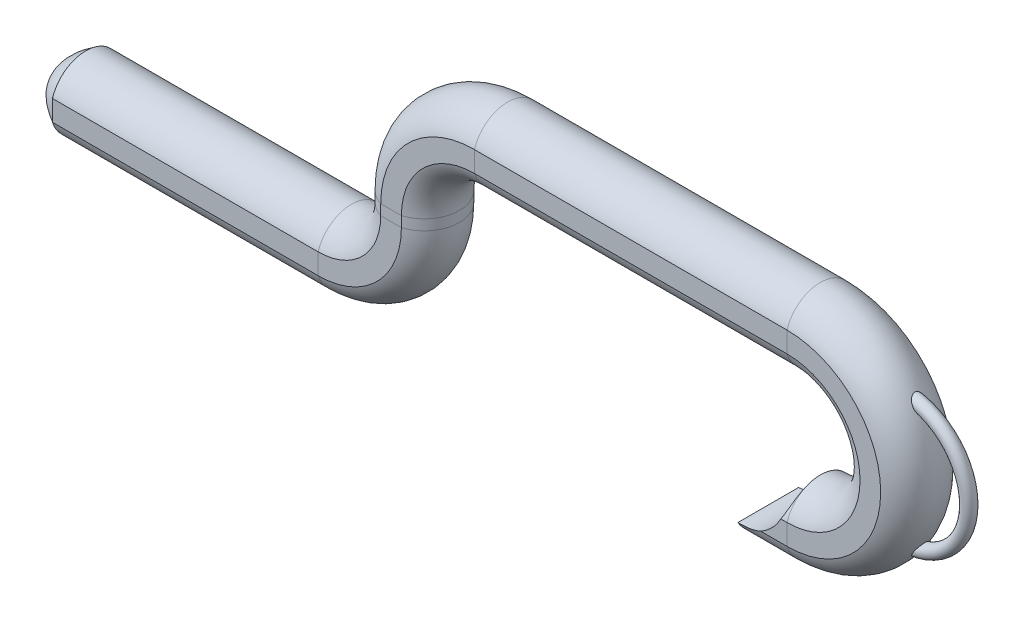
ISO-10303-21;
HEADER;
FILE_DESCRIPTION(('STEP AP214'),'2;1');
FILE_NAME('part.step','',(''),(''),'','','');
FILE_SCHEMA(('AUTOMOTIVE_DESIGN { 1 0 10303 214 1 1 1 1 }'));
ENDSEC;
DATA;
#1=APPLICATION_CONTEXT('core data for automotive mechanical design processes');
#2=APPLICATION_PROTOCOL_DEFINITION('international standard','automotive_design',2000,#1);
#3=PRODUCT_CONTEXT('',#1,'mechanical');
#4=PRODUCT('Part','Part','',(#3));
#5=PRODUCT_RELATED_PRODUCT_CATEGORY('part','',(#4));
#6=PRODUCT_DEFINITION_FORMATION('','',#4);
#7=PRODUCT_DEFINITION_CONTEXT('part definition',#1,'design');
#8=PRODUCT_DEFINITION('design','',#6,#7);
#9=PRODUCT_DEFINITION_SHAPE('','',#8);
#10=(LENGTH_UNIT() NAMED_UNIT(*) SI_UNIT(.MILLI.,.METRE.));
#11=(NAMED_UNIT(*) PLANE_ANGLE_UNIT() SI_UNIT($,.RADIAN.));
#12=(NAMED_UNIT(*) SI_UNIT($,.STERADIAN.) SOLID_ANGLE_UNIT());
#13=UNCERTAINTY_MEASURE_WITH_UNIT(LENGTH_MEASURE(1.E-05),#10,'distance_accuracy_value','');
#14=(GEOMETRIC_REPRESENTATION_CONTEXT(3) GLOBAL_UNCERTAINTY_ASSIGNED_CONTEXT((#13)) GLOBAL_UNIT_ASSIGNED_CONTEXT((#10,
#11,#12)) REPRESENTATION_CONTEXT('',''));
#15=CARTESIAN_POINT('',(0.,0.,0.));
#16=DIRECTION('',(0.,0.,1.));
#17=DIRECTION('',(1.,0.,0.));
#18=AXIS2_PLACEMENT_3D('',#15,#16,#17);
#19=CARTESIAN_POINT('',(97.9634972677596,22.5372950819672,0.));
#20=DIRECTION('',(1.,0.,0.));
#21=DIRECTION('',(0.,1.,0.));
#22=AXIS2_PLACEMENT_3D('',#19,#20,#21);
#23=PLANE('',#22);
#24=CARTESIAN_POINT('',(97.9634972677596,22.5372950819672,0.));
#25=DIRECTION('',(1.,0.,0.));
#26=DIRECTION('',(0.,1.,0.));
#27=AXIS2_PLACEMENT_3D('',#24,#25,#26);
#28=CIRCLE('',#27,1.5875);
#29=CARTESIAN_POINT('',(97.9634972677596,24.1247950819672,0.));
#30=VERTEX_POINT('',#29);
#31=EDGE_CURVE('E73',#30,#30,#28,.T.);
#32=ORIENTED_EDGE('',*,*,#31,.F.);
#33=EDGE_LOOP('',(#32));
#34=FACE_BOUND('',#33,.T.);
#35=ADVANCED_FACE('F67',(#34),#23,.F.);
#36=CARTESIAN_POINT('',(97.9634972677596,-9.21270491803278,0.));
#37=DIRECTION('',(-1.,0.,0.));
#38=DIRECTION('',(0.,-1.,0.));
#39=AXIS2_PLACEMENT_3D('',#36,#37,#38);
#40=PLANE('',#39);
#41=CARTESIAN_POINT('',(97.9634972677596,-9.21270491803278,0.));
#42=DIRECTION('',(-1.,0.,0.));
#43=DIRECTION('',(0.,-1.,0.));
#44=AXIS2_PLACEMENT_3D('',#41,#42,#43);
#45=CIRCLE('',#44,1.5875);
#46=CARTESIAN_POINT('',(97.9634972677596,-10.8002049180328,0.));
#47=VERTEX_POINT('',#46);
#48=EDGE_CURVE('E12',#47,#47,#45,.T.);
#49=ORIENTED_EDGE('',*,*,#48,.T.);
#50=EDGE_LOOP('',(#49));
#51=FACE_BOUND('',#50,.T.);
#52=ADVANCED_FACE('F82',(#51),#40,.T.);
#53=CARTESIAN_POINT('',(97.9634972677596,6.66229508196722,0.));
#54=DIRECTION('',(0.,0.,-1.));
#55=DIRECTION('',(-1.,0.,0.));
#56=AXIS2_PLACEMENT_3D('',#53,#54,#55);
#57=TOROIDAL_SURFACE('',#56,15.875,1.5875);
#58=CARTESIAN_POINT('',(97.9634972677596,6.66229508196722,0.));
#59=DIRECTION('',(0.,0.,-1.));
#60=DIRECTION('',(-1.,0.,0.));
#61=AXIS2_PLACEMENT_3D('',#58,#59,#60);
#62=CIRCLE('',#61,17.4625);
#63=EDGE_CURVE('',#30,#47,#62,.T.);
#64=ORIENTED_EDGE('',*,*,#31,.T.);
#65=ORIENTED_EDGE('',*,*,#48,.F.);
#66=ORIENTED_EDGE('',*,*,#63,.T.);
#67=ORIENTED_EDGE('',*,*,#63,.F.);
#68=EDGE_LOOP('',(#64,#66,#65,#67));
#69=FACE_BOUND('',#68,.T.);
#70=ADVANCED_FACE('F79',(#69),#57,.T.);
#71=CLOSED_SHELL('',(#35,#52,#70));
#72=MANIFOLD_SOLID_BREP('B2',#71);
#73=CARTESIAN_POINT('',(77.6434972677596,-13.6577049180328,0.));
#74=DIRECTION('',(-1.,0.,0.));
#75=DIRECTION('',(0.,-1.,0.));
#76=AXIS2_PLACEMENT_3D('',#73,#74,#75);
#77=CYLINDRICAL_SURFACE('',#76,8.509);
#78=DIRECTION('',(-1.,0.,0.));
#79=VECTOR('',#78,1.);
#80=CARTESIAN_POINT('',(77.6434972677596,-11.1400280126297,-8.128));
#81=LINE('',#80,#79);
#82=CARTESIAN_POINT('',(77.6434972677596,-11.1400280126297,-8.128));
#83=VERTEX_POINT('',#82);
#84=CARTESIAN_POINT('',(76.1414456323552,-11.1400280126297,-8.128));
#85=VERTEX_POINT('',#84);
#86=EDGE_CURVE('E293',#83,#85,#81,.T.);
#87=ORIENTED_EDGE('',*,*,#86,.T.);
#88=CARTESIAN_POINT('',(76.1414456323552,-11.1400280126297,-8.128));
#89=CARTESIAN_POINT('',(76.2393674737089,-10.9571043769839,-8.07138468523003));
#90=CARTESIAN_POINT('',(76.331828270218,-10.7734230906575,-8.00767703956395));
#91=CARTESIAN_POINT('',(76.5058092619242,-10.4064490587135,-7.86580718000569));
#92=CARTESIAN_POINT('',(76.5873287183264,-10.2231563401548,-7.78764399087474));
#93=CARTESIAN_POINT('',(76.7391641296345,-9.85944223705123,-7.6168607202547));
#94=CARTESIAN_POINT('',(76.8095133931071,-9.67901381702869,-7.52428531466233));
#95=CARTESIAN_POINT('',(76.9395819208842,-9.32242649123616,-7.32462827188387));
#96=CARTESIAN_POINT('',(76.9993021589215,-9.14626719564711,-7.21754796508674));
#97=CARTESIAN_POINT('',(77.1087029166804,-8.79984504772809,-6.98909086010844));
#98=CARTESIAN_POINT('',(77.1583695459037,-8.62959061916133,-6.86769464378302));
#99=CARTESIAN_POINT('',(77.2482936283772,-8.29698582039228,-6.61134332857102));
#100=CARTESIAN_POINT('',(77.2885506883891,-8.1346357807492,-6.4763876633541));
#101=CARTESIAN_POINT('',(77.3605585775105,-7.81942271683401,-6.19373545221656));
#102=CARTESIAN_POINT('',(77.3923092232341,-7.66655989714712,-6.04603863170593));
#103=CARTESIAN_POINT('',(77.4483290315737,-7.37170061499983,-5.73886393378898));
#104=CARTESIAN_POINT('',(77.4725982017842,-7.22970414150917,-5.57938606834174));
#105=CARTESIAN_POINT('',(77.5149045707958,-6.95672708830278,-5.24845985582079));
#106=CARTESIAN_POINT('',(77.5328936939684,-6.82583705670299,-5.07693074331336));
#107=CARTESIAN_POINT('',(77.5635159878337,-6.57727527370921,-4.72410502410556));
#108=CARTESIAN_POINT('',(77.5761491361555,-6.45960357752684,-4.54280837661189));
#109=CARTESIAN_POINT('',(77.5971630073093,-6.23825243328302,-4.17151570376571));
#110=CARTESIAN_POINT('',(77.6055416517381,-6.13457984215986,-3.98151547586961));
#111=CARTESIAN_POINT('',(77.6190662780872,-5.94197234001313,-3.59407304285009));
#112=CARTESIAN_POINT('',(77.6242121050104,-5.85303813577077,-3.39663048138561));
#113=CARTESIAN_POINT('',(77.6324790741073,-5.68474516320099,-2.98138298969299));
#114=CARTESIAN_POINT('',(77.6354323456495,-5.60649990572489,-2.76312264449274));
#115=CARTESIAN_POINT('',(77.6396699640831,-5.46807377834055,-2.32092742256507));
#116=CARTESIAN_POINT('',(77.6409542415569,-5.4078936598866,-2.09699231020481));
#117=CARTESIAN_POINT('',(77.6426254136974,-5.30600657929572,-1.64495946723621));
#118=CARTESIAN_POINT('',(77.6430123281166,-5.26429921055923,-1.41686182836339));
#119=CARTESIAN_POINT('',(77.6434363297928,-5.19963475326357,-0.958024469388721));
#120=CARTESIAN_POINT('',(77.643473414702,-5.17667779053413,-0.727284731566883));
#121=CARTESIAN_POINT('',(77.6435051144772,-5.14925646673543,-0.257648346186935));
#122=CARTESIAN_POINT('',(77.6434984011048,-5.1453767758146,-0.0187173476060032));
#123=CARTESIAN_POINT('',(77.6434954978481,-5.15771981794944,0.458628868183089));
#124=CARTESIAN_POINT('',(77.6434993082272,-5.17394305405771,0.69704407233453));
#125=CARTESIAN_POINT('',(77.6432867295246,-5.22638248824919,1.17171148598985));
#126=CARTESIAN_POINT('',(77.643070299049,-5.2626024441013,1.40796328046189));
#127=CARTESIAN_POINT('',(77.6419087411532,-5.35478098605646,1.87658206822876));
#128=CARTESIAN_POINT('',(77.6409636158947,-5.41073951360573,2.10894907304553));
#129=CARTESIAN_POINT('',(77.6375724027517,-5.54212521196989,2.56859747654295));
#130=CARTESIAN_POINT('',(77.6351233695492,-5.61759041714617,2.795867986486));
#131=CARTESIAN_POINT('',(77.627711885644,-5.7873878233986,3.24321227827554));
#132=CARTESIAN_POINT('',(77.6227494125142,-5.88172019281974,3.46328599588722));
#133=CARTESIAN_POINT('',(77.6090983767004,-6.08853558632631,3.89460575173751));
#134=CARTESIAN_POINT('',(77.6004100005645,-6.20101770151642,4.10585223135626));
#135=CARTESIAN_POINT('',(77.5779330220304,-6.44323931907324,4.5179287877328));
#136=CARTESIAN_POINT('',(77.564144532316,-6.57297844011649,4.71875909451775));
#137=CARTESIAN_POINT('',(77.5302315629417,-6.84659718794236,5.10560489217543));
#138=CARTESIAN_POINT('',(77.5102020147949,-6.99024407275975,5.29179318758307));
#139=CARTESIAN_POINT('',(77.4622833857618,-7.29190516025835,5.65107855858151));
#140=CARTESIAN_POINT('',(77.4343942799869,-7.44991940843503,5.82417559271455));
#141=CARTESIAN_POINT('',(77.3693269505909,-7.77869016079772,6.1558737941844));
#142=CARTESIAN_POINT('',(77.3321504151468,-7.9494443452923,6.31447758881089));
#143=CARTESIAN_POINT('',(77.2471846506548,-8.30181459437112,6.61598601250478));
#144=CARTESIAN_POINT('',(77.1993966250577,-8.48342942554241,6.75889241907071));
#145=CARTESIAN_POINT('',(77.0955246384518,-8.84343743956994,7.01940745246683));
#146=CARTESIAN_POINT('',(77.0401671255453,-9.0212932352083,7.13804967998041));
#147=CARTESIAN_POINT('',(76.9184671998122,-9.38266690453963,7.36017049729845));
#148=CARTESIAN_POINT('',(76.8521235873058,-9.56618539481498,7.46364742872675));
#149=CARTESIAN_POINT('',(76.7081603433889,-9.93640609757852,7.6549567936143));
#150=CARTESIAN_POINT('',(76.6305622157125,-10.1231016523958,7.74281836608921));
#151=CARTESIAN_POINT('',(76.4638599659942,-10.4978396580186,7.90315284688198));
#152=CARTESIAN_POINT('',(76.3747630372901,-10.6858811979286,7.97563530163218));
#153=CARTESIAN_POINT('',(76.2575287006954,-10.9180364690406,8.05602389314797));
#154=CARTESIAN_POINT('',(76.2347442698479,-10.9625035123569,8.07100740951006));
#155=CARTESIAN_POINT('',(76.1885606365218,-11.0513355954967,8.10012958899504));
#156=CARTESIAN_POINT('',(76.1651620518625,-11.0957006924257,8.11426905759285));
#157=CARTESIAN_POINT('',(76.1414456323552,-11.1400280126297,8.12800000000001));
#158=B_SPLINE_CURVE_WITH_KNOTS('',3,(#88,#89,#90,#91,#92,#93,#94,#95,#96,#97,#98,#99,#100,#101,
#102,#103,#104,#105,#106,#107,#108,#109,#110,#111,#112,#113,#114,#115,#116,#117,#118,#119,#120,
#121,#122,#123,#124,#125,#126,#127,#128,#129,#130,#131,#132,#133,#134,#135,#136,#137,#138,#139,
#140,#141,#142,#143,#144,#145,#146,#147,#148,#149,#150,#151,#152,#153,#154,#155,#156,#157),
.UNSPECIFIED.,.F.,.F.,(4,2,2,2,2,2,2,2,2,2,2,2,2,2,2,2,2,2,2,2,2,2,2,2,2,2,2,2,2,2,2,2,2,2,4),
(0.,0.645063733567459,1.29017100204675,1.93331694608611,2.57640394069665,3.22037347681894,
3.86436992046559,4.50838024661996,5.15238991904044,5.80122680341165,6.45006639780642,
7.0992226580447,7.748410039651,8.44325989606483,9.13813865209466,9.83300211254395,
10.5278702360265,11.2439070386308,11.9599617595933,12.6761510868573,13.3923382895891,
14.1099325972415,14.8275333080181,15.5450980942353,16.2626470272474,16.9697743902782,
17.6769039925647,18.3839051532294,19.090826173693,19.7525156049286,20.4142773402271,
21.0747909252374,21.7348932957642,21.8913760954736,22.0477070943477),.UNSPECIFIED.);
#159=CARTESIAN_POINT('',(77.6434972677596,-5.14870491803279,0.));
#160=VERTEX_POINT('',#159);
#161=EDGE_CURVE('E481',#85,#160,#158,.T.);
#162=ORIENTED_EDGE('',*,*,#161,.T.);
#163=CARTESIAN_POINT('',(77.6434972677596,-13.6577049180328,0.));
#164=DIRECTION('',(1.,0.,0.));
#165=DIRECTION('',(0.,0.,-1.));
#166=AXIS2_PLACEMENT_3D('',#163,#164,#165);
#167=CIRCLE('',#166,8.509);
#168=EDGE_CURVE('E276',#83,#160,#167,.T.);
#169=ORIENTED_EDGE('',*,*,#168,.F.);
#170=EDGE_LOOP('',(#87,#162,#169));
#171=FACE_BOUND('',#170,.T.);
#172=ADVANCED_FACE('F108',(#171),#77,.T.);
#173=CARTESIAN_POINT('',(-101.42650273224,-16.1753818234358,8.12800000000001));
#174=CARTESIAN_POINT('',(-101.42650273224,-14.4969305531671,8.128));
#175=CARTESIAN_POINT('',(-101.42650273224,-12.8184792828984,8.128));
#176=CARTESIAN_POINT('',(-101.42650273224,-11.1400280126297,8.12799999999999));
#177=CARTESIAN_POINT('',(-101.42650273224,-25.9306473640173,5.10627180639812));
#178=CARTESIAN_POINT('',(-114.677228143642,-17.7486857333609,5.1062718063981));
#179=CARTESIAN_POINT('',(-115.449340704489,-9.56672410270453,5.10627180639809));
#180=CARTESIAN_POINT('',(-101.42650273224,-1.38476247204831,5.10627180639807));
#181=CARTESIAN_POINT('',(-101.42650273224,-25.9306473640173,-5.1062718063981));
#182=CARTESIAN_POINT('',(-114.102218924987,-17.7486857333609,-5.10627180639809));
#183=CARTESIAN_POINT('',(-116.620022349169,-9.56672410270453,-5.10627180639808));
#184=CARTESIAN_POINT('',(-101.42650273224,-1.3847624720483,-5.10627180639807));
#185=CARTESIAN_POINT('',(-101.42650273224,-16.1753818234358,-8.128));
#186=CARTESIAN_POINT('',(-101.42650273224,-14.4969305531671,-8.128));
#187=CARTESIAN_POINT('',(-101.42650273224,-12.8184792828984,-8.128));
#188=CARTESIAN_POINT('',(-101.42650273224,-11.1400280126297,-8.12799999999999));
#189=(BOUNDED_SURFACE() B_SPLINE_SURFACE(3,3,((#173,#174,#175,#176),(#177,#178,#179,#180),(#181,
#182,#183,#184),(#185,#186,#187,#188)),.UNSPECIFIED.,.F.,.F.,
.F.) B_SPLINE_SURFACE_WITH_KNOTS((4,4),(4,4),(0.,1.),(0.,1.),
.UNSPECIFIED.) GEOMETRIC_REPRESENTATION_ITEM() RATIONAL_B_SPLINE_SURFACE(((1.,1.,1.,1.),
(0.530589329369143,0.530589329369143,0.530589329369146,0.530589329369146),(0.530589329369143,
0.530589329369143,0.530589329369146,0.530589329369146),(1.,1.,1.,1.))) REPRESENTATION_ITEM('') SURFACE());
#190=CARTESIAN_POINT('',(-101.42650273224,-13.6577049180328,0.));
#191=DIRECTION('',(-1.,0.,0.));
#192=DIRECTION('',(0.,0.,-1.));
#193=AXIS2_PLACEMENT_3D('',#190,#191,#192);
#194=CIRCLE('',#193,8.509);
#195=CARTESIAN_POINT('',(-101.42650273224,-16.1753818234358,-8.128));
#196=VERTEX_POINT('',#195);
#197=CARTESIAN_POINT('',(-101.42650273224,-16.1753818234358,8.12800000000001));
#198=VERTEX_POINT('',#197);
#199=EDGE_CURVE('E284',#196,#198,#194,.T.);
#200=DIRECTION('',(0.,-1.,0.));
#201=VECTOR('',#200,1.);
#202=CARTESIAN_POINT('',(-101.42650273224,-11.1400280126297,8.128));
#203=LINE('',#202,#201);
#204=CARTESIAN_POINT('',(-101.42650273224,-11.1400280126297,8.12799999999999));
#205=VERTEX_POINT('',#204);
#206=EDGE_CURVE('E114',#205,#198,#203,.T.);
#207=CARTESIAN_POINT('',(-101.42650273224,-13.6577049180328,0.));
#208=DIRECTION('',(-1.,0.,0.));
#209=DIRECTION('',(0.,0.,-1.));
#210=AXIS2_PLACEMENT_3D('',#207,#208,#209);
#211=CIRCLE('',#210,8.509);
#212=CARTESIAN_POINT('',(-101.42650273224,-11.1400280126297,-8.12799999999999));
#213=VERTEX_POINT('',#212);
#214=EDGE_CURVE('E289',#205,#213,#211,.T.);
#215=DIRECTION('',(0.,1.,0.));
#216=VECTOR('',#215,1.);
#217=CARTESIAN_POINT('',(-101.42650273224,-11.1400280126297,-8.128));
#218=LINE('',#217,#216);
#219=EDGE_CURVE('E290',#196,#213,#218,.T.);
#220=ORIENTED_EDGE('',*,*,#199,.T.);
#221=ORIENTED_EDGE('',*,*,#206,.F.);
#222=ORIENTED_EDGE('',*,*,#214,.T.);
#223=ORIENTED_EDGE('',*,*,#219,.F.);
#224=EDGE_LOOP('',(#220,#221,#222,#223));
#225=FACE_BOUND('',#224,.T.);
#226=ADVANCED_FACE('F110',(#225),#189,.F.);
#227=CARTESIAN_POINT('',(64.9434972677596,-13.6577049180328,0.));
#228=DIRECTION('',(1.,0.,0.));
#229=DIRECTION('',(0.,0.,-1.));
#230=AXIS2_PLACEMENT_3D('',#227,#228,#229);
#231=PLANE('',#230);
#232=CARTESIAN_POINT('',(64.9434972677596,-13.6577049180328,0.));
#233=DIRECTION('',(1.,0.,0.));
#234=DIRECTION('',(0.,0.,-1.));
#235=AXIS2_PLACEMENT_3D('',#232,#233,#234);
#236=CIRCLE('',#235,8.509);
#237=CARTESIAN_POINT('',(64.9434972677596,-17.8487049180328,7.40530890645353));
#238=VERTEX_POINT('',#237);
#239=CARTESIAN_POINT('',(64.9434972677596,-17.8487049180328,-7.40530890645353));
#240=VERTEX_POINT('',#239);
#241=EDGE_CURVE('E121',#238,#240,#236,.T.);
#242=ORIENTED_EDGE('',*,*,#241,.F.);
#243=DIRECTION('',(0.,0.,1.));
#244=VECTOR('',#243,1.);
#245=CARTESIAN_POINT('',(64.9434972677596,-17.8487049180328,-20.066));
#246=LINE('',#245,#244);
#247=EDGE_CURVE('E770',#240,#238,#246,.T.);
#248=ORIENTED_EDGE('',*,*,#247,.F.);
#249=EDGE_LOOP('',(#242,#248));
#250=FACE_BOUND('',#249,.T.);
#251=ADVANCED_FACE('F558',(#250),#231,.F.);
#252=CARTESIAN_POINT('',(-101.42650273224,-13.6577049180328,0.));
#253=DIRECTION('',(1.,0.,0.));
#254=DIRECTION('',(0.,0.,-1.));
#255=AXIS2_PLACEMENT_3D('',#252,#253,#254);
#256=CYLINDRICAL_SURFACE('',#255,8.509);
#257=DIRECTION('',(1.,0.,0.));
#258=VECTOR('',#257,1.);
#259=CARTESIAN_POINT('',(-102.42650273224,-16.1753818234358,8.128));
#260=LINE('',#259,#258);
#261=CARTESIAN_POINT('',(-36.6565027322406,-16.1753818234358,8.128));
#262=VERTEX_POINT('',#261);
#263=EDGE_CURVE('E160',#198,#262,#260,.T.);
#264=ORIENTED_EDGE('',*,*,#263,.F.);
#265=ORIENTED_EDGE('',*,*,#199,.F.);
#266=DIRECTION('',(1.,0.,0.));
#267=VECTOR('',#266,1.);
#268=CARTESIAN_POINT('',(-102.42650273224,-16.1753818234358,-8.128));
#269=LINE('',#268,#267);
#270=CARTESIAN_POINT('',(-36.6565027322406,-16.1753818234358,-8.128));
#271=VERTEX_POINT('',#270);
#272=EDGE_CURVE('E308',#196,#271,#269,.T.);
#273=ORIENTED_EDGE('',*,*,#272,.T.);
#274=CARTESIAN_POINT('',(-36.6565027322406,-13.6577049180328,0.));
#275=DIRECTION('',(-1.,0.,0.));
#276=DIRECTION('',(0.,0.,-1.));
#277=AXIS2_PLACEMENT_3D('',#274,#275,#276);
#278=CIRCLE('',#277,8.509);
#279=EDGE_CURVE('E371',#271,#262,#278,.T.);
#280=ORIENTED_EDGE('',*,*,#279,.T.);
#281=EDGE_LOOP('',(#264,#265,#273,#280));
#282=FACE_BOUND('',#281,.T.);
#283=ADVANCED_FACE('F555',(#282),#256,.T.);
#284=DIRECTION('',(1.,0.,0.));
#285=VECTOR('',#284,1.);
#286=CARTESIAN_POINT('',(-102.42650273224,-11.1400280126297,8.128));
#287=LINE('',#286,#285);
#288=CARTESIAN_POINT('',(-36.6565027322406,-11.1400280126297,8.128));
#289=VERTEX_POINT('',#288);
#290=EDGE_CURVE('E152',#205,#289,#287,.T.);
#291=ORIENTED_EDGE('',*,*,#290,.T.);
#292=CARTESIAN_POINT('',(-36.6565027322406,-11.1400280126297,-8.128));
#293=VERTEX_POINT('',#292);
#294=EDGE_CURVE('E288',#289,#293,#278,.T.);
#295=ORIENTED_EDGE('',*,*,#294,.T.);
#296=DIRECTION('',(1.,0.,0.));
#297=VECTOR('',#296,1.);
#298=CARTESIAN_POINT('',(-102.42650273224,-11.1400280126297,-8.128));
#299=LINE('',#298,#297);
#300=EDGE_CURVE('E305',#213,#293,#299,.T.);
#301=ORIENTED_EDGE('',*,*,#300,.F.);
#302=ORIENTED_EDGE('',*,*,#214,.F.);
#303=EDGE_LOOP('',(#291,#295,#301,#302));
#304=FACE_BOUND('',#303,.T.);
#305=ADVANCED_FACE('F309',(#304),#256,.T.);
#306=CARTESIAN_POINT('',(-36.6565027322404,4.12229508196721,0.));
#307=DIRECTION('',(0.,0.,1.));
#308=DIRECTION('',(1.,0.,0.));
#309=AXIS2_PLACEMENT_3D('',#306,#307,#308);
#310=TOROIDAL_SURFACE('',#309,17.78,8.509);
#311=CARTESIAN_POINT('',(-36.6565027322404,4.12229508196721,8.128));
#312=DIRECTION('',(0.,0.,1.));
#313=DIRECTION('',(0.,-1.,0.));
#314=AXIS2_PLACEMENT_3D('',#311,#312,#313);
#315=CIRCLE('',#314,20.2976769054038);
#316=CARTESIAN_POINT('',(-16.3588258268366,4.12229508196721,8.128));
#317=VERTEX_POINT('',#316);
#318=EDGE_CURVE('E446',#262,#317,#315,.T.);
#319=ORIENTED_EDGE('',*,*,#318,.F.);
#320=ORIENTED_EDGE('',*,*,#279,.F.);
#321=CARTESIAN_POINT('',(-36.6565027322404,4.12229508196721,-8.128));
#322=DIRECTION('',(0.,0.,1.));
#323=DIRECTION('',(0.,-1.,0.));
#324=AXIS2_PLACEMENT_3D('',#321,#322,#323);
#325=CIRCLE('',#324,20.2976769054038);
#326=CARTESIAN_POINT('',(-16.3588258268366,4.12229508196721,-8.128));
#327=VERTEX_POINT('',#326);
#328=EDGE_CURVE('E322',#271,#327,#325,.T.);
#329=ORIENTED_EDGE('',*,*,#328,.T.);
#330=CARTESIAN_POINT('',(-18.8765027322404,4.12229508196721,0.));
#331=DIRECTION('',(0.,-1.,0.));
#332=DIRECTION('',(0.,0.,-1.));
#333=AXIS2_PLACEMENT_3D('',#330,#331,#332);
#334=CIRCLE('',#333,8.509);
#335=EDGE_CURVE('E376',#327,#317,#334,.T.);
#336=ORIENTED_EDGE('',*,*,#335,.T.);
#337=EDGE_LOOP('',(#319,#320,#329,#336));
#338=FACE_BOUND('',#337,.T.);
#339=ADVANCED_FACE('F560',(#338),#310,.T.);
#340=CARTESIAN_POINT('',(-36.6565027322404,4.12229508196721,8.128));
#341=DIRECTION('',(0.,0.,1.));
#342=DIRECTION('',(0.,-1.,0.));
#343=AXIS2_PLACEMENT_3D('',#340,#341,#342);
#344=CIRCLE('',#343,15.2623230945976);
#345=CARTESIAN_POINT('',(-21.3941796376428,4.12229508196721,8.128));
#346=VERTEX_POINT('',#345);
#347=EDGE_CURVE('E450',#289,#346,#344,.T.);
#348=ORIENTED_EDGE('',*,*,#347,.T.);
#349=CARTESIAN_POINT('',(-21.3941796376428,4.12229508196721,-8.128));
#350=VERTEX_POINT('',#349);
#351=EDGE_CURVE('E375',#346,#350,#334,.T.);
#352=ORIENTED_EDGE('',*,*,#351,.T.);
#353=CARTESIAN_POINT('',(-36.6565027322404,4.12229508196721,-8.128));
#354=DIRECTION('',(0.,0.,1.));
#355=DIRECTION('',(0.,-1.,0.));
#356=AXIS2_PLACEMENT_3D('',#353,#354,#355);
#357=CIRCLE('',#356,15.2623230945976);
#358=EDGE_CURVE('E328',#293,#350,#357,.T.);
#359=ORIENTED_EDGE('',*,*,#358,.F.);
#360=ORIENTED_EDGE('',*,*,#294,.F.);
#361=EDGE_LOOP('',(#348,#352,#359,#360));
#362=FACE_BOUND('',#361,.T.);
#363=ADVANCED_FACE('F563',(#362),#310,.T.);
#364=CARTESIAN_POINT('',(-18.8765027322404,4.12229508196721,0.));
#365=DIRECTION('',(0.,1.,0.));
#366=DIRECTION('',(0.,0.,1.));
#367=AXIS2_PLACEMENT_3D('',#364,#365,#366);
#368=CYLINDRICAL_SURFACE('',#367,8.509);
#369=DIRECTION('',(0.,1.,0.));
#370=VECTOR('',#369,1.);
#371=CARTESIAN_POINT('',(-16.3588258268374,4.12229508196721,8.128));
#372=LINE('',#371,#370);
#373=CARTESIAN_POINT('',(-16.3588258268374,6.66229508196708,8.128));
#374=VERTEX_POINT('',#373);
#375=EDGE_CURVE('E452',#317,#374,#372,.T.);
#376=ORIENTED_EDGE('',*,*,#375,.F.);
#377=ORIENTED_EDGE('',*,*,#335,.F.);
#378=DIRECTION('',(0.,1.,0.));
#379=VECTOR('',#378,1.);
#380=CARTESIAN_POINT('',(-16.3588258268374,4.12229508196721,-8.128));
#381=LINE('',#380,#379);
#382=CARTESIAN_POINT('',(-16.3588258268374,6.66229508196708,-8.128));
#383=VERTEX_POINT('',#382);
#384=EDGE_CURVE('E332',#327,#383,#381,.T.);
#385=ORIENTED_EDGE('',*,*,#384,.T.);
#386=CARTESIAN_POINT('',(-18.8765027322404,6.66229508196707,0.));
#387=DIRECTION('',(0.,-1.,0.));
#388=DIRECTION('',(0.,0.,-1.));
#389=AXIS2_PLACEMENT_3D('',#386,#387,#388);
#390=CIRCLE('',#389,8.509);
#391=EDGE_CURVE('E380',#383,#374,#390,.T.);
#392=ORIENTED_EDGE('',*,*,#391,.T.);
#393=EDGE_LOOP('',(#376,#377,#385,#392));
#394=FACE_BOUND('',#393,.T.);
#395=ADVANCED_FACE('F565',(#394),#368,.T.);
#396=DIRECTION('',(0.,1.,0.));
#397=VECTOR('',#396,1.);
#398=CARTESIAN_POINT('',(-21.3941796376435,4.12229508196721,8.128));
#399=LINE('',#398,#397);
#400=CARTESIAN_POINT('',(-21.3941796376435,6.66229508196708,8.128));
#401=VERTEX_POINT('',#400);
#402=EDGE_CURVE('E395',#346,#401,#399,.T.);
#403=ORIENTED_EDGE('',*,*,#402,.T.);
#404=CARTESIAN_POINT('',(-21.3941796376435,6.66229508196708,-8.128));
#405=VERTEX_POINT('',#404);
#406=EDGE_CURVE('E379',#401,#405,#390,.T.);
#407=ORIENTED_EDGE('',*,*,#406,.T.);
#408=DIRECTION('',(0.,1.,0.));
#409=VECTOR('',#408,1.);
#410=CARTESIAN_POINT('',(-21.3941796376435,4.12229508196721,-8.128));
#411=LINE('',#410,#409);
#412=EDGE_CURVE('E326',#350,#405,#411,.T.);
#413=ORIENTED_EDGE('',*,*,#412,.F.);
#414=ORIENTED_EDGE('',*,*,#351,.F.);
#415=EDGE_LOOP('',(#403,#407,#413,#414));
#416=FACE_BOUND('',#415,.T.);
#417=ADVANCED_FACE('F393',(#416),#368,.T.);
#418=CARTESIAN_POINT('',(1.44349726775957,6.66229508196723,0.));
#419=DIRECTION('',(0.,0.,-1.));
#420=DIRECTION('',(-1.,0.,0.));
#421=AXIS2_PLACEMENT_3D('',#418,#419,#420);
#422=TOROIDAL_SURFACE('',#421,20.32,8.509);
#423=CARTESIAN_POINT('',(1.44349726775957,6.66229508196723,8.128));
#424=DIRECTION('',(0.,0.,-1.));
#425=DIRECTION('',(-1.,0.,0.));
#426=AXIS2_PLACEMENT_3D('',#423,#424,#425);
#427=CIRCLE('',#426,22.8376769054031);
#428=CARTESIAN_POINT('',(1.4434972677598,29.4999719873703,8.128));
#429=VERTEX_POINT('',#428);
#430=EDGE_CURVE('E407',#401,#429,#427,.T.);
#431=ORIENTED_EDGE('',*,*,#430,.T.);
#432=CARTESIAN_POINT('',(1.44349726775971,26.9822950819672,0.));
#433=DIRECTION('',(-1.,0.,0.));
#434=DIRECTION('',(0.,0.,-1.));
#435=AXIS2_PLACEMENT_3D('',#432,#433,#434);
#436=CIRCLE('',#435,8.509);
#437=CARTESIAN_POINT('',(1.4434972677598,29.4999719873703,-8.128));
#438=VERTEX_POINT('',#437);
#439=EDGE_CURVE('E383',#429,#438,#436,.T.);
#440=ORIENTED_EDGE('',*,*,#439,.T.);
#441=CARTESIAN_POINT('',(1.44349726775957,6.66229508196723,-8.128));
#442=DIRECTION('',(0.,0.,-1.));
#443=DIRECTION('',(-1.,0.,0.));
#444=AXIS2_PLACEMENT_3D('',#441,#442,#443);
#445=CIRCLE('',#444,22.8376769054031);
#446=EDGE_CURVE('E336',#405,#438,#445,.T.);
#447=ORIENTED_EDGE('',*,*,#446,.F.);
#448=ORIENTED_EDGE('',*,*,#406,.F.);
#449=EDGE_LOOP('',(#431,#440,#447,#448));
#450=FACE_BOUND('',#449,.T.);
#451=ADVANCED_FACE('F405',(#450),#422,.T.);
#452=CARTESIAN_POINT('',(1.44349726775957,6.66229508196723,8.128));
#453=DIRECTION('',(0.,0.,-1.));
#454=DIRECTION('',(-1.,0.,0.));
#455=AXIS2_PLACEMENT_3D('',#452,#453,#454);
#456=CIRCLE('',#455,17.8023230945969);
#457=CARTESIAN_POINT('',(1.4434972677598,24.4646181765642,8.128));
#458=VERTEX_POINT('',#457);
#459=EDGE_CURVE('E414',#374,#458,#456,.T.);
#460=ORIENTED_EDGE('',*,*,#459,.F.);
#461=ORIENTED_EDGE('',*,*,#391,.F.);
#462=CARTESIAN_POINT('',(1.44349726775957,6.66229508196723,-8.128));
#463=DIRECTION('',(0.,0.,-1.));
#464=DIRECTION('',(-1.,0.,0.));
#465=AXIS2_PLACEMENT_3D('',#462,#463,#464);
#466=CIRCLE('',#465,17.8023230945969);
#467=CARTESIAN_POINT('',(1.4434972677598,24.4646181765642,-8.128));
#468=VERTEX_POINT('',#467);
#469=EDGE_CURVE('E341',#383,#468,#466,.T.);
#470=ORIENTED_EDGE('',*,*,#469,.T.);
#471=EDGE_CURVE('E260',#468,#458,#436,.T.);
#472=ORIENTED_EDGE('',*,*,#471,.T.);
#473=EDGE_LOOP('',(#460,#461,#470,#472));
#474=FACE_BOUND('',#473,.T.);
#475=ADVANCED_FACE('F412',(#474),#422,.T.);
#476=CARTESIAN_POINT('',(1.44349726775971,26.9822950819672,0.));
#477=DIRECTION('',(1.,0.,0.));
#478=DIRECTION('',(0.,0.,-1.));
#479=AXIS2_PLACEMENT_3D('',#476,#477,#478);
#480=CYLINDRICAL_SURFACE('',#479,8.509);
#481=DIRECTION('',(1.,0.,0.));
#482=VECTOR('',#481,1.);
#483=CARTESIAN_POINT('',(1.44349726775971,24.4646181765642,8.128));
#484=LINE('',#483,#482);
#485=CARTESIAN_POINT('',(77.6434972677596,24.4646181765642,8.128));
#486=VERTEX_POINT('',#485);
#487=EDGE_CURVE('E432',#458,#486,#484,.T.);
#488=ORIENTED_EDGE('',*,*,#487,.F.);
#489=ORIENTED_EDGE('',*,*,#471,.F.);
#490=DIRECTION('',(1.,0.,0.));
#491=VECTOR('',#490,1.);
#492=CARTESIAN_POINT('',(1.44349726775971,24.4646181765642,-8.128));
#493=LINE('',#492,#491);
#494=CARTESIAN_POINT('',(77.6434972677596,24.4646181765642,-8.128));
#495=VERTEX_POINT('',#494);
#496=EDGE_CURVE('E246',#468,#495,#493,.T.);
#497=ORIENTED_EDGE('',*,*,#496,.T.);
#498=CARTESIAN_POINT('',(77.6434972677596,26.9822950819672,0.));
#499=DIRECTION('',(-1.,0.,0.));
#500=DIRECTION('',(0.,0.,-1.));
#501=AXIS2_PLACEMENT_3D('',#498,#499,#500);
#502=CIRCLE('',#501,8.509);
#503=EDGE_CURVE('E258',#495,#486,#502,.T.);
#504=ORIENTED_EDGE('',*,*,#503,.T.);
#505=EDGE_LOOP('',(#488,#489,#497,#504));
#506=FACE_BOUND('',#505,.T.);
#507=ADVANCED_FACE('F257',(#506),#480,.T.);
#508=DIRECTION('',(1.,0.,0.));
#509=VECTOR('',#508,1.);
#510=CARTESIAN_POINT('',(1.44349726775971,29.4999719873703,8.128));
#511=LINE('',#510,#509);
#512=CARTESIAN_POINT('',(77.6434972677596,29.4999719873703,8.128));
#513=VERTEX_POINT('',#512);
#514=EDGE_CURVE('E428',#429,#513,#511,.T.);
#515=ORIENTED_EDGE('',*,*,#514,.T.);
#516=CARTESIAN_POINT('',(77.6434972677596,29.4999719873703,-8.128));
#517=VERTEX_POINT('',#516);
#518=EDGE_CURVE('E270',#513,#517,#502,.T.);
#519=ORIENTED_EDGE('',*,*,#518,.T.);
#520=DIRECTION('',(1.,0.,0.));
#521=VECTOR('',#520,1.);
#522=CARTESIAN_POINT('',(1.44349726775971,29.4999719873703,-8.128));
#523=LINE('',#522,#521);
#524=EDGE_CURVE('E249',#438,#517,#523,.T.);
#525=ORIENTED_EDGE('',*,*,#524,.F.);
#526=ORIENTED_EDGE('',*,*,#439,.F.);
#527=EDGE_LOOP('',(#515,#519,#525,#526));
#528=FACE_BOUND('',#527,.T.);
#529=ADVANCED_FACE('F571',(#528),#480,.T.);
#530=CARTESIAN_POINT('',(77.6434972677596,6.66229508196722,0.));
#531=DIRECTION('',(0.,0.,-1.));
#532=DIRECTION('',(-1.,0.,0.));
#533=AXIS2_PLACEMENT_3D('',#530,#531,#532);
#534=TOROIDAL_SURFACE('',#533,20.32,8.509);
#535=CARTESIAN_POINT('',(77.6434972677596,6.66229508196722,8.128));
#536=DIRECTION('',(0.,0.,-1.));
#537=DIRECTION('',(0.,1.,0.));
#538=AXIS2_PLACEMENT_3D('',#535,#536,#537);
#539=CIRCLE('',#538,22.8376769054031);
#540=CARTESIAN_POINT('',(77.6434972677596,-16.1753818234359,8.128));
#541=VERTEX_POINT('',#540);
#542=EDGE_CURVE('E436',#513,#541,#539,.T.);
#543=ORIENTED_EDGE('',*,*,#542,.T.);
#544=CARTESIAN_POINT('',(77.6434972677596,-16.1753818234359,-8.128));
#545=VERTEX_POINT('',#544);
#546=EDGE_CURVE('E269',#541,#545,#167,.T.);
#547=ORIENTED_EDGE('',*,*,#546,.T.);
#548=CARTESIAN_POINT('',(77.6434972677596,6.66229508196722,-8.128));
#549=DIRECTION('',(0.,0.,-1.));
#550=DIRECTION('',(0.,1.,0.));
#551=AXIS2_PLACEMENT_3D('',#548,#549,#550);
#552=CIRCLE('',#551,22.8376769054031);
#553=EDGE_CURVE('E262',#517,#545,#552,.T.);
#554=ORIENTED_EDGE('',*,*,#553,.F.);
#555=ORIENTED_EDGE('',*,*,#518,.F.);
#556=EDGE_LOOP('',(#543,#547,#554,#555));
#557=FACE_BOUND('',#556,.T.);
#558=ADVANCED_FACE('F572',(#557),#534,.T.);
#559=CARTESIAN_POINT('',(77.6434972677596,6.66229508196722,8.128));
#560=DIRECTION('',(0.,0.,-1.));
#561=DIRECTION('',(0.,1.,0.));
#562=AXIS2_PLACEMENT_3D('',#559,#560,#561);
#563=CIRCLE('',#562,17.802323094597);
#564=CARTESIAN_POINT('',(77.6434972677596,-11.1400280126297,8.128));
#565=VERTEX_POINT('',#564);
#566=EDGE_CURVE('E267',#486,#565,#563,.T.);
#567=ORIENTED_EDGE('',*,*,#566,.F.);
#568=ORIENTED_EDGE('',*,*,#503,.F.);
#569=CARTESIAN_POINT('',(77.6434972677596,6.66229508196722,-8.128));
#570=DIRECTION('',(0.,0.,-1.));
#571=DIRECTION('',(0.,1.,0.));
#572=AXIS2_PLACEMENT_3D('',#569,#570,#571);
#573=CIRCLE('',#572,17.8023230945969);
#574=EDGE_CURVE('E227',#495,#83,#573,.T.);
#575=ORIENTED_EDGE('',*,*,#574,.T.);
#576=ORIENTED_EDGE('',*,*,#168,.T.);
#577=EDGE_CURVE('E274',#160,#565,#167,.T.);
#578=ORIENTED_EDGE('',*,*,#577,.T.);
#579=EDGE_LOOP('',(#567,#568,#575,#576,#578));
#580=FACE_BOUND('',#579,.T.);
#581=ADVANCED_FACE('F265',(#580),#534,.T.);
#582=ORIENTED_EDGE('',*,*,#577,.F.);
#583=CARTESIAN_POINT('',(76.1414456323552,-11.1400280126297,8.12800000000001));
#584=VERTEX_POINT('',#583);
#585=EDGE_CURVE('E477',#160,#584,#158,.T.);
#586=ORIENTED_EDGE('',*,*,#585,.T.);
#587=DIRECTION('',(-1.,0.,0.));
#588=VECTOR('',#587,1.);
#589=CARTESIAN_POINT('',(77.6434972677596,-11.1400280126297,8.128));
#590=LINE('',#589,#588);
#591=EDGE_CURVE('E319',#565,#584,#590,.T.);
#592=ORIENTED_EDGE('',*,*,#591,.F.);
#593=EDGE_LOOP('',(#582,#586,#592));
#594=FACE_BOUND('',#593,.T.);
#595=ADVANCED_FACE('F475',(#594),#77,.T.);
#596=DIRECTION('',(-1.,0.,0.));
#597=VECTOR('',#596,1.);
#598=CARTESIAN_POINT('',(77.6434972677596,-16.1753818234359,8.128));
#599=LINE('',#598,#597);
#600=CARTESIAN_POINT('',(71.2444810341131,-16.1753818234359,8.128));
#601=VERTEX_POINT('',#600);
#602=EDGE_CURVE('E317',#541,#601,#599,.T.);
#603=ORIENTED_EDGE('',*,*,#602,.T.);
#604=CARTESIAN_POINT('',(71.2444810341131,-16.1753818234359,8.12799999999999));
#605=CARTESIAN_POINT('',(70.9308128105348,-16.3546111872485,8.07243818784638));
#606=CARTESIAN_POINT('',(70.6098004305142,-16.5203027971472,8.01465785939678));
#607=CARTESIAN_POINT('',(69.9543903630894,-16.8239610623075,7.89965153938633));
#608=CARTESIAN_POINT('',(69.6199784661956,-16.961897298519,7.84242622074974));
#609=CARTESIAN_POINT('',(68.9480009215569,-17.2060085806972,7.73498159523061));
#610=CARTESIAN_POINT('',(68.6107078308787,-17.3128719738301,7.68462617063485));
#611=CARTESIAN_POINT('',(67.9273960105622,-17.498263508052,7.59367285158813));
#612=CARTESIAN_POINT('',(67.5813840387673,-17.5768129133649,7.55306764226486));
#613=CARTESIAN_POINT('',(66.8582959660048,-17.7092672655466,7.48291506201065));
#614=CARTESIAN_POINT('',(66.480732285884,-17.7610798975884,7.45433239661993));
#615=CARTESIAN_POINT('',(65.9090023949907,-17.8134247921546,7.42518894255355));
#616=CARTESIAN_POINT('',(65.71625648306,-17.8266453318532,7.41776041912977));
#617=CARTESIAN_POINT('',(65.3301853685152,-17.8442877503901,7.40781057428994));
#618=CARTESIAN_POINT('',(65.1368600253405,-17.8487072858669,7.40529055982085));
#619=CARTESIAN_POINT('',(64.9434972677596,-17.8487049180328,7.40530890645353));
#620=B_SPLINE_CURVE_WITH_KNOTS('',3,(#604,#605,#606,#607,#608,#609,#610,#611,#612,#613,#614,
#615,#616,#617,#618,#619),.UNSPECIFIED.,.F.,.F.,(4,2,2,2,2,2,2,4),(0.,1.09622008231317,
2.19363512224426,3.26447052078502,4.33450002223202,5.47889993488598,6.05869428706735,
6.63864299507047),.UNSPECIFIED.);
#621=EDGE_CURVE('E129',#601,#238,#620,.T.);
#622=ORIENTED_EDGE('',*,*,#621,.T.);
#623=ORIENTED_EDGE('',*,*,#241,.T.);
#624=CARTESIAN_POINT('',(64.9434972677596,-17.8487049180328,-7.40530890645353));
#625=CARTESIAN_POINT('',(65.1273242392074,-17.8487105309028,-7.40528801835407));
#626=CARTESIAN_POINT('',(65.3111453683758,-17.8447138480244,-7.40756720231268));
#627=CARTESIAN_POINT('',(65.6783153318244,-17.8287588891974,-7.41657218467292));
#628=CARTESIAN_POINT('',(65.8616642105718,-17.8168013925686,-7.42329754781761));
#629=CARTESIAN_POINT('',(66.227306983885,-17.7849815597472,-7.44103373911881));
#630=CARTESIAN_POINT('',(66.4096016539443,-17.7651260714581,-7.45204085462716));
#631=CARTESIAN_POINT('',(66.772868596857,-17.7175937648876,-7.47804191021872));
#632=CARTESIAN_POINT('',(66.9538408591665,-17.6899168843133,-7.49303588205488));
#633=CARTESIAN_POINT('',(67.4860203761169,-17.5967265632491,-7.54268809176379));
#634=CARTESIAN_POINT('',(67.8349030771108,-17.5203081822872,-7.58245861131477));
#635=CARTESIAN_POINT('',(68.5236811255585,-17.3388305661859,-7.67219569845019));
#636=CARTESIAN_POINT('',(68.8635776550514,-17.2337751187302,-7.72216091741234));
#637=CARTESIAN_POINT('',(69.3741967230244,-17.0522289573283,-7.80288215567255));
#638=CARTESIAN_POINT('',(69.5488757645478,-16.9857394790071,-7.83154212801911));
#639=CARTESIAN_POINT('',(69.8949537111376,-16.8451976306009,-7.88978823415036));
#640=CARTESIAN_POINT('',(70.0663536313528,-16.7711476475974,-7.91937407357725));
#641=CARTESIAN_POINT('',(70.4077788118675,-16.6146254117051,-7.97914835588567));
#642=CARTESIAN_POINT('',(70.5777610912098,-16.5320606009914,-8.00933973156175));
#643=CARTESIAN_POINT('',(70.913992949101,-16.3593651869816,-8.06922892699875));
#644=CARTESIAN_POINT('',(71.0802413852212,-16.2692323070323,-8.09892659499891));
#645=CARTESIAN_POINT('',(71.2444810341131,-16.1753818234359,-8.12799999999999));
#646=B_SPLINE_CURVE_WITH_KNOTS('',3,(#624,#625,#626,#627,#628,#629,#630,#631,#632,#633,#634,
#635,#636,#637,#638,#639,#640,#641,#642,#643,#644,#645),.UNSPECIFIED.,.F.,.F.,(4,2,2,2,2,2,2,2,
2,2,4),(0.,0.551413441672371,1.10277291093793,1.65365536587808,2.20454220840364,
3.28104741862045,4.3574103138293,4.92452584352926,5.4914628680746,6.0653875596754,
6.63948552414779),.UNSPECIFIED.);
#647=CARTESIAN_POINT('',(71.2444810341131,-16.1753818234359,-8.128));
#648=VERTEX_POINT('',#647);
#649=EDGE_CURVE('E486',#240,#648,#646,.T.);
#650=ORIENTED_EDGE('',*,*,#649,.T.);
#651=DIRECTION('',(-1.,0.,0.));
#652=VECTOR('',#651,1.);
#653=CARTESIAN_POINT('',(77.6434972677596,-16.1753818234359,-8.128));
#654=LINE('',#653,#652);
#655=EDGE_CURVE('E240',#545,#648,#654,.T.);
#656=ORIENTED_EDGE('',*,*,#655,.F.);
#657=ORIENTED_EDGE('',*,*,#546,.F.);
#658=EDGE_LOOP('',(#603,#622,#623,#650,#656,#657));
#659=FACE_BOUND('',#658,.T.);
#660=ADVANCED_FACE('F540',(#659),#77,.T.);
#661=CARTESIAN_POINT('',(-102.42650273224,-11.1400280126297,-8.128));
#662=DIRECTION('',(0.,0.,-1.));
#663=DIRECTION('',(0.,1.,0.));
#664=AXIS2_PLACEMENT_3D('',#661,#662,#663);
#665=PLANE('',#664);
#666=ORIENTED_EDGE('',*,*,#219,.T.);
#667=ORIENTED_EDGE('',*,*,#300,.T.);
#668=DIRECTION('',(0.,1.,0.));
#669=VECTOR('',#668,1.);
#670=CARTESIAN_POINT('',(-36.6565027322406,-11.1400280126297,-8.128));
#671=LINE('',#670,#669);
#672=EDGE_CURVE('E315',#271,#293,#671,.T.);
#673=ORIENTED_EDGE('',*,*,#672,.F.);
#674=ORIENTED_EDGE('',*,*,#272,.F.);
#675=EDGE_LOOP('',(#666,#667,#673,#674));
#676=FACE_BOUND('',#675,.T.);
#677=ADVANCED_FACE('F303',(#676),#665,.T.);
#678=CARTESIAN_POINT('',(-36.6565027322405,-11.1400280126304,-8.128));
#679=DIRECTION('',(0.,0.,-1.));
#680=DIRECTION('',(-1.,0.,0.));
#681=AXIS2_PLACEMENT_3D('',#678,#679,#680);
#682=PLANE('',#681);
#683=DIRECTION('',(-1.,0.,0.));
#684=VECTOR('',#683,1.);
#685=CARTESIAN_POINT('',(-21.3941796376435,4.12229508196721,-8.128));
#686=LINE('',#685,#684);
#687=EDGE_CURVE('E327',#327,#350,#686,.T.);
#688=ORIENTED_EDGE('',*,*,#687,.F.);
#689=ORIENTED_EDGE('',*,*,#328,.F.);
#690=ORIENTED_EDGE('',*,*,#672,.T.);
#691=ORIENTED_EDGE('',*,*,#358,.T.);
#692=EDGE_LOOP('',(#688,#689,#690,#691));
#693=FACE_BOUND('',#692,.T.);
#694=ADVANCED_FACE('F517',(#693),#682,.T.);
#695=CARTESIAN_POINT('',(-21.3941796376435,4.12229508196721,-8.128));
#696=DIRECTION('',(0.,0.,-1.));
#697=DIRECTION('',(-1.,0.,0.));
#698=AXIS2_PLACEMENT_3D('',#695,#696,#697);
#699=PLANE('',#698);
#700=DIRECTION('',(-1.,0.,0.));
#701=VECTOR('',#700,1.);
#702=CARTESIAN_POINT('',(-21.3941796376435,6.66229508196708,-8.128));
#703=LINE('',#702,#701);
#704=EDGE_CURVE('E337',#383,#405,#703,.T.);
#705=ORIENTED_EDGE('',*,*,#704,.F.);
#706=ORIENTED_EDGE('',*,*,#384,.F.);
#707=ORIENTED_EDGE('',*,*,#687,.T.);
#708=ORIENTED_EDGE('',*,*,#412,.T.);
#709=EDGE_LOOP('',(#705,#706,#707,#708));
#710=FACE_BOUND('',#709,.T.);
#711=ADVANCED_FACE('F403',(#710),#699,.T.);
#712=CARTESIAN_POINT('',(-21.3941796376435,6.66229508196707,-8.128));
#713=DIRECTION('',(0.,0.,-1.));
#714=DIRECTION('',(-1.,0.,0.));
#715=AXIS2_PLACEMENT_3D('',#712,#713,#714);
#716=PLANE('',#715);
#717=DIRECTION('',(0.,1.,0.));
#718=VECTOR('',#717,1.);
#719=CARTESIAN_POINT('',(1.4434972677598,29.4999719873696,-8.128));
#720=LINE('',#719,#718);
#721=EDGE_CURVE('E345',#468,#438,#720,.T.);
#722=ORIENTED_EDGE('',*,*,#721,.F.);
#723=ORIENTED_EDGE('',*,*,#469,.F.);
#724=ORIENTED_EDGE('',*,*,#704,.T.);
#725=ORIENTED_EDGE('',*,*,#446,.T.);
#726=EDGE_LOOP('',(#722,#723,#724,#725));
#727=FACE_BOUND('',#726,.T.);
#728=ADVANCED_FACE('F401',(#727),#716,.T.);
#729=CARTESIAN_POINT('',(1.44349726775971,29.4999719873703,-8.128));
#730=DIRECTION('',(0.,0.,-1.));
#731=DIRECTION('',(0.,1.,0.));
#732=AXIS2_PLACEMENT_3D('',#729,#730,#731);
#733=PLANE('',#732);
#734=DIRECTION('',(0.,1.,0.));
#735=VECTOR('',#734,1.);
#736=CARTESIAN_POINT('',(77.6434972677596,29.4999719873703,-8.128));
#737=LINE('',#736,#735);
#738=EDGE_CURVE('E231',#495,#517,#737,.T.);
#739=ORIENTED_EDGE('',*,*,#738,.F.);
#740=ORIENTED_EDGE('',*,*,#496,.F.);
#741=ORIENTED_EDGE('',*,*,#721,.T.);
#742=ORIENTED_EDGE('',*,*,#524,.T.);
#743=EDGE_LOOP('',(#739,#740,#741,#742));
#744=FACE_BOUND('',#743,.T.);
#745=ADVANCED_FACE('F244',(#744),#733,.T.);
#746=CARTESIAN_POINT('',(77.6434972677596,29.4999719873703,-8.128));
#747=DIRECTION('',(0.,0.,-1.));
#748=DIRECTION('',(-1.,0.,0.));
#749=AXIS2_PLACEMENT_3D('',#746,#747,#748);
#750=PLANE('',#749);
#751=DIRECTION('',(0.,-1.,0.));
#752=VECTOR('',#751,1.);
#753=CARTESIAN_POINT('',(77.6434972677596,-16.1753818234359,-8.128));
#754=LINE('',#753,#752);
#755=EDGE_CURVE('E234',#83,#545,#754,.T.);
#756=ORIENTED_EDGE('',*,*,#755,.F.);
#757=ORIENTED_EDGE('',*,*,#574,.F.);
#758=ORIENTED_EDGE('',*,*,#738,.T.);
#759=ORIENTED_EDGE('',*,*,#553,.T.);
#760=EDGE_LOOP('',(#756,#757,#758,#759));
#761=FACE_BOUND('',#760,.T.);
#762=ADVANCED_FACE('F229',(#761),#750,.T.);
#763=CARTESIAN_POINT('',(77.6434972677596,-16.1753818234359,-8.128));
#764=DIRECTION('',(0.,0.,-1.));
#765=DIRECTION('',(0.,1.,0.));
#766=AXIS2_PLACEMENT_3D('',#763,#764,#765);
#767=PLANE('',#766);
#768=CARTESIAN_POINT('',(64.9434972677596,-5.14870491803279,-8.12799999999999));
#769=DIRECTION('',(0.,0.,-1.));
#770=DIRECTION('',(0.,1.,0.));
#771=AXIS2_PLACEMENT_3D('',#768,#769,#770);
#772=CIRCLE('',#771,12.7);
#773=EDGE_CURVE('E778',#85,#648,#772,.T.);
#774=ORIENTED_EDGE('',*,*,#773,.F.);
#775=ORIENTED_EDGE('',*,*,#86,.F.);
#776=ORIENTED_EDGE('',*,*,#755,.T.);
#777=ORIENTED_EDGE('',*,*,#655,.T.);
#778=EDGE_LOOP('',(#774,#775,#776,#777));
#779=FACE_BOUND('',#778,.T.);
#780=ADVANCED_FACE('F516',(#779),#767,.T.);
#781=CARTESIAN_POINT('',(-102.42650273224,-11.1400280126297,8.128));
#782=DIRECTION('',(0.,0.,1.));
#783=DIRECTION('',(0.,-1.,0.));
#784=AXIS2_PLACEMENT_3D('',#781,#782,#783);
#785=PLANE('',#784);
#786=ORIENTED_EDGE('',*,*,#206,.T.);
#787=ORIENTED_EDGE('',*,*,#263,.T.);
#788=DIRECTION('',(0.,-1.,0.));
#789=VECTOR('',#788,1.);
#790=CARTESIAN_POINT('',(-36.6565027322406,-11.1400280126297,8.128));
#791=LINE('',#790,#789);
#792=EDGE_CURVE('E443',#289,#262,#791,.T.);
#793=ORIENTED_EDGE('',*,*,#792,.F.);
#794=ORIENTED_EDGE('',*,*,#290,.F.);
#795=EDGE_LOOP('',(#786,#787,#793,#794));
#796=FACE_BOUND('',#795,.T.);
#797=ADVANCED_FACE('F511',(#796),#785,.T.);
#798=CARTESIAN_POINT('',(-36.6565027322405,-11.1400280126304,8.128));
#799=DIRECTION('',(0.,0.,1.));
#800=DIRECTION('',(1.,0.,0.));
#801=AXIS2_PLACEMENT_3D('',#798,#799,#800);
#802=PLANE('',#801);
#803=DIRECTION('',(1.,0.,0.));
#804=VECTOR('',#803,1.);
#805=CARTESIAN_POINT('',(-21.3941796376435,4.12229508196721,8.128));
#806=LINE('',#805,#804);
#807=EDGE_CURVE('E447',#346,#317,#806,.T.);
#808=ORIENTED_EDGE('',*,*,#807,.F.);
#809=ORIENTED_EDGE('',*,*,#347,.F.);
#810=ORIENTED_EDGE('',*,*,#792,.T.);
#811=ORIENTED_EDGE('',*,*,#318,.T.);
#812=EDGE_LOOP('',(#808,#809,#810,#811));
#813=FACE_BOUND('',#812,.T.);
#814=ADVANCED_FACE('F510',(#813),#802,.T.);
#815=CARTESIAN_POINT('',(-21.3941796376435,4.12229508196721,8.128));
#816=DIRECTION('',(0.,0.,1.));
#817=DIRECTION('',(1.,0.,0.));
#818=AXIS2_PLACEMENT_3D('',#815,#816,#817);
#819=PLANE('',#818);
#820=DIRECTION('',(1.,0.,0.));
#821=VECTOR('',#820,1.);
#822=CARTESIAN_POINT('',(-21.3941796376435,6.66229508196708,8.128));
#823=LINE('',#822,#821);
#824=EDGE_CURVE('E423',#401,#374,#823,.T.);
#825=ORIENTED_EDGE('',*,*,#824,.F.);
#826=ORIENTED_EDGE('',*,*,#402,.F.);
#827=ORIENTED_EDGE('',*,*,#807,.T.);
#828=ORIENTED_EDGE('',*,*,#375,.T.);
#829=EDGE_LOOP('',(#825,#826,#827,#828));
#830=FACE_BOUND('',#829,.T.);
#831=ADVANCED_FACE('F520',(#830),#819,.T.);
#832=CARTESIAN_POINT('',(-21.3941796376435,6.66229508196707,8.128));
#833=DIRECTION('',(0.,0.,1.));
#834=DIRECTION('',(1.,0.,0.));
#835=AXIS2_PLACEMENT_3D('',#832,#833,#834);
#836=PLANE('',#835);
#837=DIRECTION('',(0.,-1.,0.));
#838=VECTOR('',#837,1.);
#839=CARTESIAN_POINT('',(1.4434972677598,29.4999719873696,8.128));
#840=LINE('',#839,#838);
#841=EDGE_CURVE('E418',#429,#458,#840,.T.);
#842=ORIENTED_EDGE('',*,*,#841,.F.);
#843=ORIENTED_EDGE('',*,*,#430,.F.);
#844=ORIENTED_EDGE('',*,*,#824,.T.);
#845=ORIENTED_EDGE('',*,*,#459,.T.);
#846=EDGE_LOOP('',(#842,#843,#844,#845));
#847=FACE_BOUND('',#846,.T.);
#848=ADVANCED_FACE('F524',(#847),#836,.T.);
#849=CARTESIAN_POINT('',(1.44349726775971,29.4999719873703,8.128));
#850=DIRECTION('',(0.,0.,1.));
#851=DIRECTION('',(0.,-1.,0.));
#852=AXIS2_PLACEMENT_3D('',#849,#850,#851);
#853=PLANE('',#852);
#854=DIRECTION('',(0.,-1.,0.));
#855=VECTOR('',#854,1.);
#856=CARTESIAN_POINT('',(77.6434972677596,29.4999719873703,8.128));
#857=LINE('',#856,#855);
#858=EDGE_CURVE('E431',#513,#486,#857,.T.);
#859=ORIENTED_EDGE('',*,*,#858,.F.);
#860=ORIENTED_EDGE('',*,*,#514,.F.);
#861=ORIENTED_EDGE('',*,*,#841,.T.);
#862=ORIENTED_EDGE('',*,*,#487,.T.);
#863=EDGE_LOOP('',(#859,#860,#861,#862));
#864=FACE_BOUND('',#863,.T.);
#865=ADVANCED_FACE('F528',(#864),#853,.T.);
#866=CARTESIAN_POINT('',(77.6434972677596,29.4999719873703,8.128));
#867=DIRECTION('',(0.,0.,1.));
#868=DIRECTION('',(1.,0.,0.));
#869=AXIS2_PLACEMENT_3D('',#866,#867,#868);
#870=PLANE('',#869);
#871=DIRECTION('',(0.,1.,0.));
#872=VECTOR('',#871,1.);
#873=CARTESIAN_POINT('',(77.6434972677596,-16.1753818234359,8.128));
#874=LINE('',#873,#872);
#875=EDGE_CURVE('E440',#541,#565,#874,.T.);
#876=ORIENTED_EDGE('',*,*,#875,.F.);
#877=ORIENTED_EDGE('',*,*,#542,.F.);
#878=ORIENTED_EDGE('',*,*,#858,.T.);
#879=ORIENTED_EDGE('',*,*,#566,.T.);
#880=EDGE_LOOP('',(#876,#877,#878,#879));
#881=FACE_BOUND('',#880,.T.);
#882=ADVANCED_FACE('F531',(#881),#870,.T.);
#883=CARTESIAN_POINT('',(77.6434972677596,-16.1753818234359,8.128));
#884=DIRECTION('',(0.,0.,1.));
#885=DIRECTION('',(0.,-1.,0.));
#886=AXIS2_PLACEMENT_3D('',#883,#884,#885);
#887=PLANE('',#886);
#888=CARTESIAN_POINT('',(64.9434972677596,-5.14870491803279,8.128));
#889=DIRECTION('',(0.,0.,1.));
#890=DIRECTION('',(0.,-1.,0.));
#891=AXIS2_PLACEMENT_3D('',#888,#889,#890);
#892=CIRCLE('',#891,12.7);
#893=EDGE_CURVE('E65',#601,#584,#892,.T.);
#894=ORIENTED_EDGE('',*,*,#893,.F.);
#895=ORIENTED_EDGE('',*,*,#602,.F.);
#896=ORIENTED_EDGE('',*,*,#875,.T.);
#897=ORIENTED_EDGE('',*,*,#591,.T.);
#898=EDGE_LOOP('',(#894,#895,#896,#897));
#899=FACE_BOUND('',#898,.T.);
#900=ADVANCED_FACE('F467',(#899),#887,.T.);
#901=CARTESIAN_POINT('',(64.9434972677596,-5.14870491803279,-20.066));
#902=DIRECTION('',(0.,0.,1.));
#903=DIRECTION('',(1.,0.,0.));
#904=AXIS2_PLACEMENT_3D('',#901,#902,#903);
#905=CYLINDRICAL_SURFACE('',#904,12.7);
#906=ORIENTED_EDGE('',*,*,#893,.T.);
#907=ORIENTED_EDGE('',*,*,#585,.F.);
#908=ORIENTED_EDGE('',*,*,#161,.F.);
#909=ORIENTED_EDGE('',*,*,#773,.T.);
#910=ORIENTED_EDGE('',*,*,#649,.F.);
#911=ORIENTED_EDGE('',*,*,#247,.T.);
#912=ORIENTED_EDGE('',*,*,#621,.F.);
#913=EDGE_LOOP('',(#906,#907,#908,#909,#910,#911,#912));
#914=FACE_BOUND('',#913,.T.);
#915=ADVANCED_FACE('F506',(#914),#905,.F.);
#916=CLOSED_SHELL('',(#172,#226,#251,#283,#305,#339,#363,#395,#417,#451,#475,#507,#529,#558,
#581,#595,#660,#677,#694,#711,#728,#745,#762,#780,#797,#814,#831,#848,#865,#882,#900,#915));
#917=MANIFOLD_SOLID_BREP('B7',#916);
#918=ADVANCED_BREP_SHAPE_REPRESENTATION('',(#18,#72,#917),#14);
#919=SHAPE_DEFINITION_REPRESENTATION(#9,#918);
ENDSEC;
END-ISO-10303-21;
